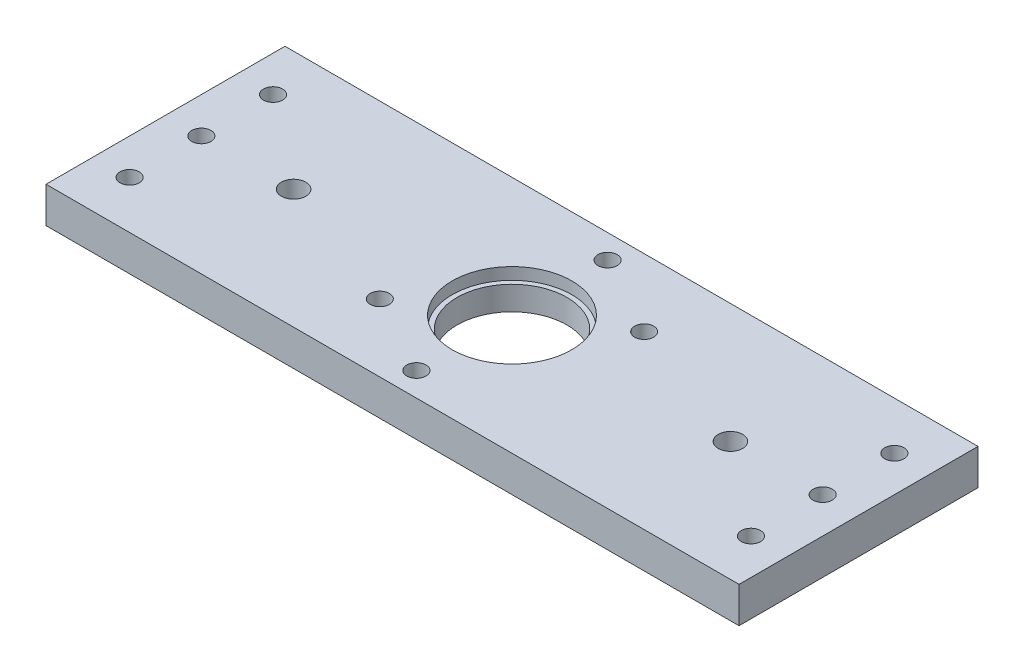
ISO-10303-21;
HEADER;
FILE_DESCRIPTION(('STEP AP214'),'2;1');
FILE_NAME('part.step','',(''),(''),'','','');
FILE_SCHEMA(('AUTOMOTIVE_DESIGN { 1 0 10303 214 1 1 1 1 }'));
ENDSEC;
DATA;
#1=APPLICATION_CONTEXT('core data for automotive mechanical design processes');
#2=APPLICATION_PROTOCOL_DEFINITION('international standard','automotive_design',2000,#1);
#3=PRODUCT_CONTEXT('',#1,'mechanical');
#4=PRODUCT('Part','Part','',(#3));
#5=PRODUCT_RELATED_PRODUCT_CATEGORY('part','',(#4));
#6=PRODUCT_DEFINITION_FORMATION('','',#4);
#7=PRODUCT_DEFINITION_CONTEXT('part definition',#1,'design');
#8=PRODUCT_DEFINITION('design','',#6,#7);
#9=PRODUCT_DEFINITION_SHAPE('','',#8);
#10=(LENGTH_UNIT() NAMED_UNIT(*) SI_UNIT(.MILLI.,.METRE.));
#11=(NAMED_UNIT(*) PLANE_ANGLE_UNIT() SI_UNIT($,.RADIAN.));
#12=(NAMED_UNIT(*) SI_UNIT($,.STERADIAN.) SOLID_ANGLE_UNIT());
#13=UNCERTAINTY_MEASURE_WITH_UNIT(LENGTH_MEASURE(1.E-05),#10,'distance_accuracy_value','');
#14=(GEOMETRIC_REPRESENTATION_CONTEXT(3) GLOBAL_UNCERTAINTY_ASSIGNED_CONTEXT((#13)) GLOBAL_UNIT_ASSIGNED_CONTEXT((#10,
#11,#12)) REPRESENTATION_CONTEXT('',''));
#15=CARTESIAN_POINT('',(0.,0.,0.));
#16=DIRECTION('',(0.,0.,1.));
#17=DIRECTION('',(1.,0.,0.));
#18=AXIS2_PLACEMENT_3D('',#15,#16,#17);
#19=CARTESIAN_POINT('',(0.,0.,0.));
#20=DIRECTION('',(0.,1.,0.));
#21=DIRECTION('',(0.,0.,1.));
#22=AXIS2_PLACEMENT_3D('',#19,#20,#21);
#23=CYLINDRICAL_SURFACE('',#22,14.605);
#24=CARTESIAN_POINT('',(0.,0.,0.));
#25=DIRECTION('',(0.,1.,0.));
#26=DIRECTION('',(0.,0.,1.));
#27=AXIS2_PLACEMENT_3D('',#24,#25,#26);
#28=CIRCLE('',#27,14.605);
#29=CARTESIAN_POINT('',(0.,0.,14.605));
#30=VERTEX_POINT('',#29);
#31=EDGE_CURVE('E103',#30,#30,#28,.T.);
#32=CARTESIAN_POINT('',(0.,6.35,0.));
#33=DIRECTION('',(0.,1.,0.));
#34=DIRECTION('',(0.,0.,1.));
#35=AXIS2_PLACEMENT_3D('',#32,#33,#34);
#36=CIRCLE('',#35,14.605);
#37=CARTESIAN_POINT('',(0.,6.35,14.605));
#38=VERTEX_POINT('',#37);
#39=EDGE_CURVE('E38',#38,#38,#36,.F.);
#40=CARTESIAN_POINT('',(0.,0.,14.605));
#41=CARTESIAN_POINT('',(0.,0.0661458333333333,14.605));
#42=CARTESIAN_POINT('',(0.,0.132291666666667,14.605));
#43=CARTESIAN_POINT('',(0.,0.264583333333333,14.605));
#44=CARTESIAN_POINT('',(0.,0.330729166666667,14.605));
#45=CARTESIAN_POINT('',(0.,0.463020833333333,14.605));
#46=CARTESIAN_POINT('',(0.,0.529166666666667,14.605));
#47=CARTESIAN_POINT('',(0.,0.661458333333333,14.605));
#48=CARTESIAN_POINT('',(0.,0.727604166666667,14.605));
#49=CARTESIAN_POINT('',(0.,0.859895833333333,14.605));
#50=CARTESIAN_POINT('',(0.,0.926041666666667,14.605));
#51=CARTESIAN_POINT('',(0.,1.05833333333333,14.605));
#52=CARTESIAN_POINT('',(0.,1.12447916666667,14.605));
#53=CARTESIAN_POINT('',(0.,1.25677083333333,14.605));
#54=CARTESIAN_POINT('',(0.,1.32291666666667,14.605));
#55=CARTESIAN_POINT('',(0.,1.45520833333333,14.605));
#56=CARTESIAN_POINT('',(0.,1.52135416666667,14.605));
#57=CARTESIAN_POINT('',(0.,1.65364583333333,14.605));
#58=CARTESIAN_POINT('',(0.,1.71979166666667,14.605));
#59=CARTESIAN_POINT('',(0.,1.85208333333333,14.605));
#60=CARTESIAN_POINT('',(0.,1.91822916666667,14.605));
#61=CARTESIAN_POINT('',(0.,2.05052083333333,14.605));
#62=CARTESIAN_POINT('',(0.,2.11666666666667,14.605));
#63=CARTESIAN_POINT('',(0.,2.24895833333333,14.605));
#64=CARTESIAN_POINT('',(0.,2.31510416666667,14.605));
#65=CARTESIAN_POINT('',(0.,2.44739583333333,14.605));
#66=CARTESIAN_POINT('',(0.,2.51354166666667,14.605));
#67=CARTESIAN_POINT('',(0.,2.64583333333333,14.605));
#68=CARTESIAN_POINT('',(0.,2.71197916666667,14.605));
#69=CARTESIAN_POINT('',(0.,2.84427083333333,14.605));
#70=CARTESIAN_POINT('',(0.,2.91041666666667,14.605));
#71=CARTESIAN_POINT('',(0.,3.04270833333333,14.605));
#72=CARTESIAN_POINT('',(0.,3.10885416666667,14.605));
#73=CARTESIAN_POINT('',(0.,3.24114583333333,14.605));
#74=CARTESIAN_POINT('',(0.,3.30729166666667,14.605));
#75=CARTESIAN_POINT('',(0.,3.43958333333333,14.605));
#76=CARTESIAN_POINT('',(0.,3.50572916666667,14.605));
#77=CARTESIAN_POINT('',(0.,3.63802083333333,14.605));
#78=CARTESIAN_POINT('',(0.,3.70416666666667,14.605));
#79=CARTESIAN_POINT('',(0.,3.83645833333333,14.605));
#80=CARTESIAN_POINT('',(0.,3.90260416666667,14.605));
#81=CARTESIAN_POINT('',(0.,4.03489583333333,14.605));
#82=CARTESIAN_POINT('',(0.,4.10104166666667,14.605));
#83=CARTESIAN_POINT('',(0.,4.23333333333333,14.605));
#84=CARTESIAN_POINT('',(0.,4.29947916666667,14.605));
#85=CARTESIAN_POINT('',(0.,4.43177083333333,14.605));
#86=CARTESIAN_POINT('',(0.,4.49791666666667,14.605));
#87=CARTESIAN_POINT('',(0.,4.63020833333333,14.605));
#88=CARTESIAN_POINT('',(0.,4.69635416666667,14.605));
#89=CARTESIAN_POINT('',(0.,4.82864583333333,14.605));
#90=CARTESIAN_POINT('',(0.,4.89479166666667,14.605));
#91=CARTESIAN_POINT('',(0.,5.02708333333333,14.605));
#92=CARTESIAN_POINT('',(0.,5.09322916666667,14.605));
#93=CARTESIAN_POINT('',(0.,5.22552083333333,14.605));
#94=CARTESIAN_POINT('',(0.,5.29166666666667,14.605));
#95=CARTESIAN_POINT('',(0.,5.42395833333333,14.605));
#96=CARTESIAN_POINT('',(0.,5.49010416666667,14.605));
#97=CARTESIAN_POINT('',(0.,5.62239583333333,14.605));
#98=CARTESIAN_POINT('',(0.,5.68854166666667,14.605));
#99=CARTESIAN_POINT('',(0.,5.82083333333333,14.605));
#100=CARTESIAN_POINT('',(0.,5.88697916666667,14.605));
#101=CARTESIAN_POINT('',(0.,6.01927083333333,14.605));
#102=CARTESIAN_POINT('',(0.,6.08541666666667,14.605));
#103=CARTESIAN_POINT('',(0.,6.21770833333333,14.605));
#104=CARTESIAN_POINT('',(0.,6.28385416666667,14.605));
#105=CARTESIAN_POINT('',(0.,6.35,14.605));
#106=B_SPLINE_CURVE_WITH_KNOTS('',3,(#40,#41,#42,#43,#44,#45,#46,#47,#48,#49,#50,#51,#52,#53,
#54,#55,#56,#57,#58,#59,#60,#61,#62,#63,#64,#65,#66,#67,#68,#69,#70,#71,#72,#73,#74,#75,#76,#77,
#78,#79,#80,#81,#82,#83,#84,#85,#86,#87,#88,#89,#90,#91,#92,#93,#94,#95,#96,#97,#98,#99,#100,
#101,#102,#103,#104,#105),.UNSPECIFIED.,.F.,.F.,(4,2,2,2,2,2,2,2,2,2,2,2,2,2,2,2,2,2,2,2,2,2,2,
2,2,2,2,2,2,2,2,2,4),(0.,0.1984375,0.396875,0.5953125,0.79375,0.9921875,1.190625,1.3890625,
1.5875,1.7859375,1.984375,2.1828125,2.38125,2.5796875,2.778125,2.9765625,3.175,3.3734375,
3.571875,3.7703125,3.96875,4.1671875,4.365625,4.5640625,4.7625,4.9609375,5.159375,5.3578125,
5.55625,5.7546875,5.953125,6.1515625,6.35),.UNSPECIFIED.);
#107=EDGE_CURVE('BSEAM34',#30,#38,#106,.T.);
#108=ORIENTED_EDGE('',*,*,#31,.F.);
#109=ORIENTED_EDGE('',*,*,#39,.F.);
#110=ORIENTED_EDGE('',*,*,#107,.T.);
#111=ORIENTED_EDGE('',*,*,#107,.F.);
#112=EDGE_LOOP('',(#108,#110,#109,#111));
#113=FACE_BOUND('',#112,.T.);
#114=ADVANCED_FACE('F34',(#113),#23,.F.);
#115=CARTESIAN_POINT('',(92.075,9.525,31.75));
#116=DIRECTION('',(-1.,0.,0.));
#117=DIRECTION('',(0.,0.,1.));
#118=AXIS2_PLACEMENT_3D('',#115,#116,#117);
#119=PLANE('',#118);
#120=DIRECTION('',(0.,0.,-1.));
#121=VECTOR('',#120,1.);
#122=CARTESIAN_POINT('',(92.075,0.,31.75));
#123=LINE('',#122,#121);
#124=CARTESIAN_POINT('',(92.075,0.,31.75));
#125=VERTEX_POINT('',#124);
#126=CARTESIAN_POINT('',(92.075,0.,-31.75));
#127=VERTEX_POINT('',#126);
#128=EDGE_CURVE('E100',#125,#127,#123,.T.);
#129=ORIENTED_EDGE('',*,*,#128,.T.);
#130=DIRECTION('',(0.,-1.,0.));
#131=VECTOR('',#130,1.);
#132=CARTESIAN_POINT('',(92.075,9.525,-31.75));
#133=LINE('',#132,#131);
#134=CARTESIAN_POINT('',(92.075,9.525,-31.75));
#135=VERTEX_POINT('',#134);
#136=EDGE_CURVE('E11',#135,#127,#133,.T.);
#137=ORIENTED_EDGE('',*,*,#136,.F.);
#138=DIRECTION('',(0.,0.,-1.));
#139=VECTOR('',#138,1.);
#140=CARTESIAN_POINT('',(92.075,9.525,31.75));
#141=LINE('',#140,#139);
#142=CARTESIAN_POINT('',(92.075,9.525,31.75));
#143=VERTEX_POINT('',#142);
#144=EDGE_CURVE('E87',#143,#135,#141,.T.);
#145=ORIENTED_EDGE('',*,*,#144,.F.);
#146=DIRECTION('',(0.,-1.,0.));
#147=VECTOR('',#146,1.);
#148=CARTESIAN_POINT('',(92.075,9.525,31.75));
#149=LINE('',#148,#147);
#150=EDGE_CURVE('E96',#143,#125,#149,.T.);
#151=ORIENTED_EDGE('',*,*,#150,.T.);
#152=EDGE_LOOP('',(#129,#137,#145,#151));
#153=FACE_BOUND('',#152,.T.);
#154=ADVANCED_FACE('F36',(#153),#119,.F.);
#155=CARTESIAN_POINT('',(-92.075,9.525,-31.75));
#156=DIRECTION('',(0.,0.,1.));
#157=DIRECTION('',(1.,0.,0.));
#158=AXIS2_PLACEMENT_3D('',#155,#156,#157);
#159=PLANE('',#158);
#160=DIRECTION('',(-1.,0.,0.));
#161=VECTOR('',#160,1.);
#162=CARTESIAN_POINT('',(-92.075,0.,-31.75));
#163=LINE('',#162,#161);
#164=CARTESIAN_POINT('',(-92.075,0.,-31.75));
#165=VERTEX_POINT('',#164);
#166=EDGE_CURVE('E91',#127,#165,#163,.T.);
#167=ORIENTED_EDGE('',*,*,#166,.T.);
#168=DIRECTION('',(0.,-1.,0.));
#169=VECTOR('',#168,1.);
#170=CARTESIAN_POINT('',(-92.075,9.525,-31.75));
#171=LINE('',#170,#169);
#172=CARTESIAN_POINT('',(-92.075,9.525,-31.75));
#173=VERTEX_POINT('',#172);
#174=EDGE_CURVE('E44',#173,#165,#171,.T.);
#175=ORIENTED_EDGE('',*,*,#174,.F.);
#176=DIRECTION('',(-1.,0.,0.));
#177=VECTOR('',#176,1.);
#178=CARTESIAN_POINT('',(-92.075,9.525,-31.75));
#179=LINE('',#178,#177);
#180=EDGE_CURVE('E82',#135,#173,#179,.T.);
#181=ORIENTED_EDGE('',*,*,#180,.F.);
#182=ORIENTED_EDGE('',*,*,#136,.T.);
#183=EDGE_LOOP('',(#167,#175,#181,#182));
#184=FACE_BOUND('',#183,.T.);
#185=ADVANCED_FACE('F90',(#184),#159,.F.);
#186=CARTESIAN_POINT('',(-92.075,9.525,31.75));
#187=DIRECTION('',(1.,0.,0.));
#188=DIRECTION('',(0.,0.,-1.));
#189=AXIS2_PLACEMENT_3D('',#186,#187,#188);
#190=PLANE('',#189);
#191=DIRECTION('',(0.,0.,1.));
#192=VECTOR('',#191,1.);
#193=CARTESIAN_POINT('',(-92.075,0.,31.75));
#194=LINE('',#193,#192);
#195=CARTESIAN_POINT('',(-92.075,0.,31.75));
#196=VERTEX_POINT('',#195);
#197=EDGE_CURVE('E69',#165,#196,#194,.T.);
#198=ORIENTED_EDGE('',*,*,#197,.T.);
#199=DIRECTION('',(0.,-1.,0.));
#200=VECTOR('',#199,1.);
#201=CARTESIAN_POINT('',(-92.075,9.525,31.75));
#202=LINE('',#201,#200);
#203=CARTESIAN_POINT('',(-92.075,9.525,31.75));
#204=VERTEX_POINT('',#203);
#205=EDGE_CURVE('E92',#204,#196,#202,.T.);
#206=ORIENTED_EDGE('',*,*,#205,.F.);
#207=DIRECTION('',(0.,0.,1.));
#208=VECTOR('',#207,1.);
#209=CARTESIAN_POINT('',(-92.075,9.525,31.75));
#210=LINE('',#209,#208);
#211=EDGE_CURVE('E85',#173,#204,#210,.T.);
#212=ORIENTED_EDGE('',*,*,#211,.F.);
#213=ORIENTED_EDGE('',*,*,#174,.T.);
#214=EDGE_LOOP('',(#198,#206,#212,#213));
#215=FACE_BOUND('',#214,.T.);
#216=ADVANCED_FACE('F94',(#215),#190,.F.);
#217=CARTESIAN_POINT('',(-92.075,9.525,31.75));
#218=DIRECTION('',(0.,0.,-1.));
#219=DIRECTION('',(-1.,0.,0.));
#220=AXIS2_PLACEMENT_3D('',#217,#218,#219);
#221=PLANE('',#220);
#222=DIRECTION('',(1.,0.,0.));
#223=VECTOR('',#222,1.);
#224=CARTESIAN_POINT('',(-92.075,0.,31.75));
#225=LINE('',#224,#223);
#226=EDGE_CURVE('E75',#196,#125,#225,.T.);
#227=ORIENTED_EDGE('',*,*,#226,.T.);
#228=ORIENTED_EDGE('',*,*,#150,.F.);
#229=DIRECTION('',(1.,0.,0.));
#230=VECTOR('',#229,1.);
#231=CARTESIAN_POINT('',(-92.075,9.525,31.75));
#232=LINE('',#231,#230);
#233=EDGE_CURVE('E52',#204,#143,#232,.T.);
#234=ORIENTED_EDGE('',*,*,#233,.F.);
#235=ORIENTED_EDGE('',*,*,#205,.T.);
#236=EDGE_LOOP('',(#227,#228,#234,#235));
#237=FACE_BOUND('',#236,.T.);
#238=ADVANCED_FACE('F108',(#237),#221,.F.);
#239=CARTESIAN_POINT('',(0.,9.525,0.));
#240=DIRECTION('',(0.,-1.,0.));
#241=DIRECTION('',(0.,0.,-1.));
#242=AXIS2_PLACEMENT_3D('',#239,#240,#241);
#243=PLANE('',#242);
#244=CARTESIAN_POINT('',(-21.329210467338,9.525,13.7922));
#245=DIRECTION('',(0.,-1.,0.));
#246=DIRECTION('',(0.,0.,-1.));
#247=AXIS2_PLACEMENT_3D('',#244,#245,#246);
#248=CIRCLE('',#247,2.54);
#249=CARTESIAN_POINT('',(-21.329210467338,9.525,11.2522));
#250=VERTEX_POINT('',#249);
#251=EDGE_CURVE('E182',#250,#250,#248,.T.);
#252=ORIENTED_EDGE('',*,*,#251,.T.);
#253=EDGE_LOOP('',(#252));
#254=FACE_BOUND('',#253,.T.);
#255=CARTESIAN_POINT('',(21.329210467338,9.525,-13.7922));
#256=DIRECTION('',(0.,-1.,0.));
#257=DIRECTION('',(0.,0.,-1.));
#258=AXIS2_PLACEMENT_3D('',#255,#256,#257);
#259=CIRCLE('',#258,2.54);
#260=CARTESIAN_POINT('',(21.329210467338,9.525,-16.3322));
#261=VERTEX_POINT('',#260);
#262=EDGE_CURVE('E186',#261,#261,#259,.T.);
#263=ORIENTED_EDGE('',*,*,#262,.T.);
#264=EDGE_LOOP('',(#263));
#265=FACE_BOUND('',#264,.T.);
#266=CARTESIAN_POINT('',(-82.55,9.525,-19.05));
#267=DIRECTION('',(0.,1.,0.));
#268=DIRECTION('',(0.,0.,1.));
#269=AXIS2_PLACEMENT_3D('',#266,#267,#268);
#270=CIRCLE('',#269,2.55270000000001);
#271=CARTESIAN_POINT('',(-82.55,9.525,-16.4973));
#272=VERTEX_POINT('',#271);
#273=EDGE_CURVE('E179',#272,#272,#270,.T.);
#274=ORIENTED_EDGE('',*,*,#273,.F.);
#275=EDGE_LOOP('',(#274));
#276=FACE_BOUND('',#275,.T.);
#277=CARTESIAN_POINT('',(-82.55,9.525,19.05));
#278=DIRECTION('',(0.,1.,0.));
#279=DIRECTION('',(0.,0.,1.));
#280=AXIS2_PLACEMENT_3D('',#277,#278,#279);
#281=CIRCLE('',#280,2.55270000000001);
#282=CARTESIAN_POINT('',(-82.55,9.525,21.6027));
#283=VERTEX_POINT('',#282);
#284=EDGE_CURVE('E173',#283,#283,#281,.T.);
#285=ORIENTED_EDGE('',*,*,#284,.F.);
#286=EDGE_LOOP('',(#285));
#287=FACE_BOUND('',#286,.T.);
#288=CARTESIAN_POINT('',(82.55,9.525,19.05));
#289=DIRECTION('',(0.,1.,0.));
#290=DIRECTION('',(0.,0.,1.));
#291=AXIS2_PLACEMENT_3D('',#288,#289,#290);
#292=CIRCLE('',#291,2.55270000000001);
#293=CARTESIAN_POINT('',(82.55,9.525,21.6027));
#294=VERTEX_POINT('',#293);
#295=EDGE_CURVE('E167',#294,#294,#292,.T.);
#296=ORIENTED_EDGE('',*,*,#295,.F.);
#297=EDGE_LOOP('',(#296));
#298=FACE_BOUND('',#297,.T.);
#299=CARTESIAN_POINT('',(82.55,9.525,-19.05));
#300=DIRECTION('',(0.,1.,0.));
#301=DIRECTION('',(0.,0.,1.));
#302=AXIS2_PLACEMENT_3D('',#299,#300,#301);
#303=CIRCLE('',#302,2.55270000000001);
#304=CARTESIAN_POINT('',(82.55,9.525,-16.4973));
#305=VERTEX_POINT('',#304);
#306=EDGE_CURVE('E161',#305,#305,#303,.T.);
#307=ORIENTED_EDGE('',*,*,#306,.F.);
#308=EDGE_LOOP('',(#307));
#309=FACE_BOUND('',#308,.T.);
#310=CARTESIAN_POINT('',(-82.55,9.525,0.));
#311=DIRECTION('',(0.,1.,0.));
#312=DIRECTION('',(0.,0.,1.));
#313=AXIS2_PLACEMENT_3D('',#310,#311,#312);
#314=CIRCLE('',#313,2.55270000000001);
#315=CARTESIAN_POINT('',(-82.55,9.525,2.55270000000001));
#316=VERTEX_POINT('',#315);
#317=EDGE_CURVE('E155',#316,#316,#314,.T.);
#318=ORIENTED_EDGE('',*,*,#317,.F.);
#319=EDGE_LOOP('',(#318));
#320=FACE_BOUND('',#319,.T.);
#321=CARTESIAN_POINT('',(82.55,9.525,0.));
#322=DIRECTION('',(0.,1.,0.));
#323=DIRECTION('',(0.,0.,1.));
#324=AXIS2_PLACEMENT_3D('',#321,#322,#323);
#325=CIRCLE('',#324,2.55270000000001);
#326=CARTESIAN_POINT('',(82.55,9.525,2.55270000000001));
#327=VERTEX_POINT('',#326);
#328=EDGE_CURVE('E149',#327,#327,#325,.T.);
#329=ORIENTED_EDGE('',*,*,#328,.F.);
#330=EDGE_LOOP('',(#329));
#331=FACE_BOUND('',#330,.T.);
#332=CARTESIAN_POINT('',(0.,9.525,0.));
#333=DIRECTION('',(0.,1.,0.));
#334=DIRECTION('',(0.,0.,1.));
#335=AXIS2_PLACEMENT_3D('',#332,#333,#334);
#336=CIRCLE('',#335,15.875);
#337=CARTESIAN_POINT('',(0.,9.525,15.875));
#338=VERTEX_POINT('',#337);
#339=EDGE_CURVE('E140',#338,#338,#336,.T.);
#340=ORIENTED_EDGE('',*,*,#339,.F.);
#341=EDGE_LOOP('',(#340));
#342=FACE_BOUND('',#341,.T.);
#343=CARTESIAN_POINT('',(-58.0390000000001,9.525,0.));
#344=DIRECTION('',(0.,-1.,0.));
#345=DIRECTION('',(0.,0.,-1.));
#346=AXIS2_PLACEMENT_3D('',#343,#344,#345);
#347=CIRCLE('',#346,3.25);
#348=CARTESIAN_POINT('',(-58.0390000000001,9.525,-3.25));
#349=VERTEX_POINT('',#348);
#350=EDGE_CURVE('E134',#349,#349,#347,.T.);
#351=ORIENTED_EDGE('',*,*,#350,.T.);
#352=EDGE_LOOP('',(#351));
#353=FACE_BOUND('',#352,.T.);
#354=CARTESIAN_POINT('',(58.039,9.525,0.));
#355=DIRECTION('',(0.,-1.,0.));
#356=DIRECTION('',(0.,0.,-1.));
#357=AXIS2_PLACEMENT_3D('',#354,#355,#356);
#358=CIRCLE('',#357,3.25);
#359=CARTESIAN_POINT('',(58.039,9.525,-3.25));
#360=VERTEX_POINT('',#359);
#361=EDGE_CURVE('E128',#360,#360,#358,.T.);
#362=ORIENTED_EDGE('',*,*,#361,.T.);
#363=EDGE_LOOP('',(#362));
#364=FACE_BOUND('',#363,.T.);
#365=CARTESIAN_POINT('',(0.,9.525,25.4));
#366=DIRECTION('',(0.,-1.,0.));
#367=DIRECTION('',(0.,0.,-1.));
#368=AXIS2_PLACEMENT_3D('',#365,#366,#367);
#369=CIRCLE('',#368,2.5527);
#370=CARTESIAN_POINT('',(0.,9.525,22.8473));
#371=VERTEX_POINT('',#370);
#372=EDGE_CURVE('E122',#371,#371,#369,.T.);
#373=ORIENTED_EDGE('',*,*,#372,.T.);
#374=EDGE_LOOP('',(#373));
#375=FACE_BOUND('',#374,.T.);
#376=CARTESIAN_POINT('',(0.,9.525,-25.4));
#377=DIRECTION('',(0.,-1.,0.));
#378=DIRECTION('',(0.,0.,-1.));
#379=AXIS2_PLACEMENT_3D('',#376,#377,#378);
#380=CIRCLE('',#379,2.5527);
#381=CARTESIAN_POINT('',(0.,9.525,-27.9527));
#382=VERTEX_POINT('',#381);
#383=EDGE_CURVE('E116',#382,#382,#380,.T.);
#384=ORIENTED_EDGE('',*,*,#383,.T.);
#385=EDGE_LOOP('',(#384));
#386=FACE_BOUND('',#385,.T.);
#387=ORIENTED_EDGE('',*,*,#144,.T.);
#388=ORIENTED_EDGE('',*,*,#180,.T.);
#389=ORIENTED_EDGE('',*,*,#211,.T.);
#390=ORIENTED_EDGE('',*,*,#233,.T.);
#391=EDGE_LOOP('',(#387,#388,#389,#390));
#392=FACE_BOUND('',#391,.T.);
#393=ADVANCED_FACE('F83',(#254,#265,#276,#287,#298,#309,#320,#331,#342,#353,#364,#375,#386,
#392),#243,.F.);
#394=CARTESIAN_POINT('',(0.,0.,0.));
#395=DIRECTION('',(0.,-1.,0.));
#396=DIRECTION('',(0.,0.,-1.));
#397=AXIS2_PLACEMENT_3D('',#394,#395,#396);
#398=PLANE('',#397);
#399=CARTESIAN_POINT('',(-21.329210467338,0.,13.7922));
#400=DIRECTION('',(0.,-1.,0.));
#401=DIRECTION('',(0.,0.,-1.));
#402=AXIS2_PLACEMENT_3D('',#399,#400,#401);
#403=CIRCLE('',#402,2.54);
#404=CARTESIAN_POINT('',(-21.329210467338,0.,11.2522));
#405=VERTEX_POINT('',#404);
#406=EDGE_CURVE('E189',#405,#405,#403,.T.);
#407=ORIENTED_EDGE('',*,*,#406,.F.);
#408=EDGE_LOOP('',(#407));
#409=FACE_BOUND('',#408,.T.);
#410=CARTESIAN_POINT('',(21.329210467338,0.,-13.7922));
#411=DIRECTION('',(0.,-1.,0.));
#412=DIRECTION('',(0.,0.,-1.));
#413=AXIS2_PLACEMENT_3D('',#410,#411,#412);
#414=CIRCLE('',#413,2.54);
#415=CARTESIAN_POINT('',(21.329210467338,0.,-16.3322));
#416=VERTEX_POINT('',#415);
#417=EDGE_CURVE('E183',#416,#416,#414,.T.);
#418=ORIENTED_EDGE('',*,*,#417,.F.);
#419=EDGE_LOOP('',(#418));
#420=FACE_BOUND('',#419,.T.);
#421=CARTESIAN_POINT('',(-82.55,0.,-19.05));
#422=DIRECTION('',(0.,1.,0.));
#423=DIRECTION('',(0.,0.,1.));
#424=AXIS2_PLACEMENT_3D('',#421,#422,#423);
#425=CIRCLE('',#424,2.55269999999999);
#426=CARTESIAN_POINT('',(-82.55,0.,-16.4973));
#427=VERTEX_POINT('',#426);
#428=EDGE_CURVE('E176',#427,#427,#425,.T.);
#429=ORIENTED_EDGE('',*,*,#428,.T.);
#430=EDGE_LOOP('',(#429));
#431=FACE_BOUND('',#430,.T.);
#432=CARTESIAN_POINT('',(-82.55,0.,19.05));
#433=DIRECTION('',(0.,1.,0.));
#434=DIRECTION('',(0.,0.,1.));
#435=AXIS2_PLACEMENT_3D('',#432,#433,#434);
#436=CIRCLE('',#435,2.55269999999999);
#437=CARTESIAN_POINT('',(-82.55,0.,21.6027));
#438=VERTEX_POINT('',#437);
#439=EDGE_CURVE('E170',#438,#438,#436,.T.);
#440=ORIENTED_EDGE('',*,*,#439,.T.);
#441=EDGE_LOOP('',(#440));
#442=FACE_BOUND('',#441,.T.);
#443=CARTESIAN_POINT('',(82.55,0.,19.05));
#444=DIRECTION('',(0.,1.,0.));
#445=DIRECTION('',(0.,0.,1.));
#446=AXIS2_PLACEMENT_3D('',#443,#444,#445);
#447=CIRCLE('',#446,2.55269999999999);
#448=CARTESIAN_POINT('',(82.55,0.,21.6027));
#449=VERTEX_POINT('',#448);
#450=EDGE_CURVE('E164',#449,#449,#447,.T.);
#451=ORIENTED_EDGE('',*,*,#450,.T.);
#452=EDGE_LOOP('',(#451));
#453=FACE_BOUND('',#452,.T.);
#454=CARTESIAN_POINT('',(82.55,0.,-19.05));
#455=DIRECTION('',(0.,1.,0.));
#456=DIRECTION('',(0.,0.,1.));
#457=AXIS2_PLACEMENT_3D('',#454,#455,#456);
#458=CIRCLE('',#457,2.55269999999999);
#459=CARTESIAN_POINT('',(82.55,0.,-16.4973));
#460=VERTEX_POINT('',#459);
#461=EDGE_CURVE('E158',#460,#460,#458,.T.);
#462=ORIENTED_EDGE('',*,*,#461,.T.);
#463=EDGE_LOOP('',(#462));
#464=FACE_BOUND('',#463,.T.);
#465=CARTESIAN_POINT('',(-82.55,0.,0.));
#466=DIRECTION('',(0.,1.,0.));
#467=DIRECTION('',(0.,0.,1.));
#468=AXIS2_PLACEMENT_3D('',#465,#466,#467);
#469=CIRCLE('',#468,2.55269999999999);
#470=CARTESIAN_POINT('',(-82.55,0.,2.55269999999999));
#471=VERTEX_POINT('',#470);
#472=EDGE_CURVE('E152',#471,#471,#469,.T.);
#473=ORIENTED_EDGE('',*,*,#472,.T.);
#474=EDGE_LOOP('',(#473));
#475=FACE_BOUND('',#474,.T.);
#476=CARTESIAN_POINT('',(82.55,0.,0.));
#477=DIRECTION('',(0.,1.,0.));
#478=DIRECTION('',(0.,0.,1.));
#479=AXIS2_PLACEMENT_3D('',#476,#477,#478);
#480=CIRCLE('',#479,2.55269999999999);
#481=CARTESIAN_POINT('',(82.55,0.,2.55269999999999));
#482=VERTEX_POINT('',#481);
#483=EDGE_CURVE('E144',#482,#482,#480,.T.);
#484=ORIENTED_EDGE('',*,*,#483,.T.);
#485=EDGE_LOOP('',(#484));
#486=FACE_BOUND('',#485,.T.);
#487=CARTESIAN_POINT('',(-58.0390000000001,0.,0.));
#488=DIRECTION('',(0.,-1.,0.));
#489=DIRECTION('',(0.,0.,-1.));
#490=AXIS2_PLACEMENT_3D('',#487,#488,#489);
#491=CIRCLE('',#490,3.25);
#492=CARTESIAN_POINT('',(-58.0390000000001,0.,-3.25));
#493=VERTEX_POINT('',#492);
#494=EDGE_CURVE('E137',#493,#493,#491,.T.);
#495=ORIENTED_EDGE('',*,*,#494,.F.);
#496=EDGE_LOOP('',(#495));
#497=FACE_BOUND('',#496,.T.);
#498=CARTESIAN_POINT('',(58.039,0.,0.));
#499=DIRECTION('',(0.,-1.,0.));
#500=DIRECTION('',(0.,0.,-1.));
#501=AXIS2_PLACEMENT_3D('',#498,#499,#500);
#502=CIRCLE('',#501,3.25);
#503=CARTESIAN_POINT('',(58.039,0.,-3.25));
#504=VERTEX_POINT('',#503);
#505=EDGE_CURVE('E131',#504,#504,#502,.T.);
#506=ORIENTED_EDGE('',*,*,#505,.F.);
#507=EDGE_LOOP('',(#506));
#508=FACE_BOUND('',#507,.T.);
#509=CARTESIAN_POINT('',(0.,0.,25.4));
#510=DIRECTION('',(0.,-1.,0.));
#511=DIRECTION('',(0.,0.,-1.));
#512=AXIS2_PLACEMENT_3D('',#509,#510,#511);
#513=CIRCLE('',#512,2.5527);
#514=CARTESIAN_POINT('',(0.,0.,22.8473));
#515=VERTEX_POINT('',#514);
#516=EDGE_CURVE('E125',#515,#515,#513,.T.);
#517=ORIENTED_EDGE('',*,*,#516,.F.);
#518=EDGE_LOOP('',(#517));
#519=FACE_BOUND('',#518,.T.);
#520=CARTESIAN_POINT('',(0.,0.,-25.4));
#521=DIRECTION('',(0.,-1.,0.));
#522=DIRECTION('',(0.,0.,-1.));
#523=AXIS2_PLACEMENT_3D('',#520,#521,#522);
#524=CIRCLE('',#523,2.5527);
#525=CARTESIAN_POINT('',(0.,0.,-27.9527));
#526=VERTEX_POINT('',#525);
#527=EDGE_CURVE('E119',#526,#526,#524,.T.);
#528=ORIENTED_EDGE('',*,*,#527,.F.);
#529=EDGE_LOOP('',(#528));
#530=FACE_BOUND('',#529,.T.);
#531=ORIENTED_EDGE('',*,*,#31,.T.);
#532=EDGE_LOOP('',(#531));
#533=FACE_BOUND('',#532,.T.);
#534=ORIENTED_EDGE('',*,*,#128,.F.);
#535=ORIENTED_EDGE('',*,*,#226,.F.);
#536=ORIENTED_EDGE('',*,*,#197,.F.);
#537=ORIENTED_EDGE('',*,*,#166,.F.);
#538=EDGE_LOOP('',(#534,#535,#536,#537));
#539=FACE_BOUND('',#538,.T.);
#540=ADVANCED_FACE('F111',(#409,#420,#431,#442,#453,#464,#475,#486,#497,#508,#519,#530,#533,
#539),#398,.T.);
#541=CARTESIAN_POINT('',(0.,0.,-25.4));
#542=DIRECTION('',(0.,-1.,0.));
#543=DIRECTION('',(0.,0.,-1.));
#544=AXIS2_PLACEMENT_3D('',#541,#542,#543);
#545=CYLINDRICAL_SURFACE('',#544,2.5527);
#546=ORIENTED_EDGE('',*,*,#383,.F.);
#547=EDGE_LOOP('',(#546));
#548=FACE_BOUND('',#547,.T.);
#549=ORIENTED_EDGE('',*,*,#527,.T.);
#550=EDGE_LOOP('',(#549));
#551=FACE_BOUND('',#550,.T.);
#552=ADVANCED_FACE('F206',(#548,#551),#545,.F.);
#553=CARTESIAN_POINT('',(0.,0.,25.4));
#554=DIRECTION('',(0.,-1.,0.));
#555=DIRECTION('',(0.,0.,-1.));
#556=AXIS2_PLACEMENT_3D('',#553,#554,#555);
#557=CYLINDRICAL_SURFACE('',#556,2.5527);
#558=ORIENTED_EDGE('',*,*,#372,.F.);
#559=EDGE_LOOP('',(#558));
#560=FACE_BOUND('',#559,.T.);
#561=ORIENTED_EDGE('',*,*,#516,.T.);
#562=EDGE_LOOP('',(#561));
#563=FACE_BOUND('',#562,.T.);
#564=ADVANCED_FACE('F259',(#560,#563),#557,.F.);
#565=CARTESIAN_POINT('',(58.039,0.,0.));
#566=DIRECTION('',(0.,-1.,0.));
#567=DIRECTION('',(0.,0.,-1.));
#568=AXIS2_PLACEMENT_3D('',#565,#566,#567);
#569=CYLINDRICAL_SURFACE('',#568,3.25);
#570=ORIENTED_EDGE('',*,*,#361,.F.);
#571=EDGE_LOOP('',(#570));
#572=FACE_BOUND('',#571,.T.);
#573=ORIENTED_EDGE('',*,*,#505,.T.);
#574=EDGE_LOOP('',(#573));
#575=FACE_BOUND('',#574,.T.);
#576=ADVANCED_FACE('F251',(#572,#575),#569,.F.);
#577=CARTESIAN_POINT('',(-58.0390000000001,0.,0.));
#578=DIRECTION('',(0.,-1.,0.));
#579=DIRECTION('',(0.,0.,-1.));
#580=AXIS2_PLACEMENT_3D('',#577,#578,#579);
#581=CYLINDRICAL_SURFACE('',#580,3.25);
#582=ORIENTED_EDGE('',*,*,#350,.F.);
#583=EDGE_LOOP('',(#582));
#584=FACE_BOUND('',#583,.T.);
#585=ORIENTED_EDGE('',*,*,#494,.T.);
#586=EDGE_LOOP('',(#585));
#587=FACE_BOUND('',#586,.T.);
#588=ADVANCED_FACE('F241',(#584,#587),#581,.F.);
#589=CARTESIAN_POINT('',(0.,6.35,0.));
#590=DIRECTION('',(0.,1.,0.));
#591=DIRECTION('',(0.,0.,1.));
#592=AXIS2_PLACEMENT_3D('',#589,#590,#591);
#593=PLANE('',#592);
#594=CARTESIAN_POINT('',(0.,6.35,0.));
#595=DIRECTION('',(0.,1.,0.));
#596=DIRECTION('',(0.,0.,1.));
#597=AXIS2_PLACEMENT_3D('',#594,#595,#596);
#598=CIRCLE('',#597,15.875);
#599=CARTESIAN_POINT('',(0.,6.35,15.875));
#600=VERTEX_POINT('',#599);
#601=EDGE_CURVE('E143',#600,#600,#598,.T.);
#602=ORIENTED_EDGE('',*,*,#601,.T.);
#603=EDGE_LOOP('',(#602));
#604=FACE_BOUND('',#603,.T.);
#605=ORIENTED_EDGE('',*,*,#39,.T.);
#606=EDGE_LOOP('',(#605));
#607=FACE_BOUND('',#606,.T.);
#608=ADVANCED_FACE('F238',(#604,#607),#593,.T.);
#609=CARTESIAN_POINT('',(0.,6.35,0.));
#610=DIRECTION('',(0.,1.,0.));
#611=DIRECTION('',(0.,0.,1.));
#612=AXIS2_PLACEMENT_3D('',#609,#610,#611);
#613=CYLINDRICAL_SURFACE('',#612,15.875);
#614=ORIENTED_EDGE('',*,*,#601,.F.);
#615=EDGE_LOOP('',(#614));
#616=FACE_BOUND('',#615,.T.);
#617=ORIENTED_EDGE('',*,*,#339,.T.);
#618=EDGE_LOOP('',(#617));
#619=FACE_BOUND('',#618,.T.);
#620=ADVANCED_FACE('F240',(#616,#619),#613,.F.);
#621=CARTESIAN_POINT('',(82.55,9.525,0.));
#622=DIRECTION('',(0.,1.,0.));
#623=DIRECTION('',(0.,0.,1.));
#624=AXIS2_PLACEMENT_3D('',#621,#622,#623);
#625=CYLINDRICAL_SURFACE('',#624,2.5527);
#626=ORIENTED_EDGE('',*,*,#483,.F.);
#627=EDGE_LOOP('',(#626));
#628=FACE_BOUND('',#627,.T.);
#629=ORIENTED_EDGE('',*,*,#328,.T.);
#630=EDGE_LOOP('',(#629));
#631=FACE_BOUND('',#630,.T.);
#632=ADVANCED_FACE('F248',(#628,#631),#625,.F.);
#633=CARTESIAN_POINT('',(-82.55,9.525,0.));
#634=DIRECTION('',(0.,1.,0.));
#635=DIRECTION('',(0.,0.,1.));
#636=AXIS2_PLACEMENT_3D('',#633,#634,#635);
#637=CYLINDRICAL_SURFACE('',#636,2.5527);
#638=ORIENTED_EDGE('',*,*,#472,.F.);
#639=EDGE_LOOP('',(#638));
#640=FACE_BOUND('',#639,.T.);
#641=ORIENTED_EDGE('',*,*,#317,.T.);
#642=EDGE_LOOP('',(#641));
#643=FACE_BOUND('',#642,.T.);
#644=ADVANCED_FACE('F305',(#640,#643),#637,.F.);
#645=CARTESIAN_POINT('',(82.55,9.525,-19.05));
#646=DIRECTION('',(0.,1.,0.));
#647=DIRECTION('',(0.,0.,1.));
#648=AXIS2_PLACEMENT_3D('',#645,#646,#647);
#649=CYLINDRICAL_SURFACE('',#648,2.5527);
#650=ORIENTED_EDGE('',*,*,#461,.F.);
#651=EDGE_LOOP('',(#650));
#652=FACE_BOUND('',#651,.T.);
#653=ORIENTED_EDGE('',*,*,#306,.T.);
#654=EDGE_LOOP('',(#653));
#655=FACE_BOUND('',#654,.T.);
#656=ADVANCED_FACE('F314',(#652,#655),#649,.F.);
#657=CARTESIAN_POINT('',(82.55,9.525,19.05));
#658=DIRECTION('',(0.,1.,0.));
#659=DIRECTION('',(0.,0.,1.));
#660=AXIS2_PLACEMENT_3D('',#657,#658,#659);
#661=CYLINDRICAL_SURFACE('',#660,2.5527);
#662=ORIENTED_EDGE('',*,*,#450,.F.);
#663=EDGE_LOOP('',(#662));
#664=FACE_BOUND('',#663,.T.);
#665=ORIENTED_EDGE('',*,*,#295,.T.);
#666=EDGE_LOOP('',(#665));
#667=FACE_BOUND('',#666,.T.);
#668=ADVANCED_FACE('F323',(#664,#667),#661,.F.);
#669=CARTESIAN_POINT('',(-82.55,9.525,19.05));
#670=DIRECTION('',(0.,1.,0.));
#671=DIRECTION('',(0.,0.,1.));
#672=AXIS2_PLACEMENT_3D('',#669,#670,#671);
#673=CYLINDRICAL_SURFACE('',#672,2.5527);
#674=ORIENTED_EDGE('',*,*,#439,.F.);
#675=EDGE_LOOP('',(#674));
#676=FACE_BOUND('',#675,.T.);
#677=ORIENTED_EDGE('',*,*,#284,.T.);
#678=EDGE_LOOP('',(#677));
#679=FACE_BOUND('',#678,.T.);
#680=ADVANCED_FACE('F333',(#676,#679),#673,.F.);
#681=CARTESIAN_POINT('',(-82.55,9.525,-19.05));
#682=DIRECTION('',(0.,1.,0.));
#683=DIRECTION('',(0.,0.,1.));
#684=AXIS2_PLACEMENT_3D('',#681,#682,#683);
#685=CYLINDRICAL_SURFACE('',#684,2.5527);
#686=ORIENTED_EDGE('',*,*,#428,.F.);
#687=EDGE_LOOP('',(#686));
#688=FACE_BOUND('',#687,.T.);
#689=ORIENTED_EDGE('',*,*,#273,.T.);
#690=EDGE_LOOP('',(#689));
#691=FACE_BOUND('',#690,.T.);
#692=ADVANCED_FACE('F343',(#688,#691),#685,.F.);
#693=CARTESIAN_POINT('',(21.329210467338,9.525,-13.7922));
#694=DIRECTION('',(0.,-1.,0.));
#695=DIRECTION('',(0.,0.,-1.));
#696=AXIS2_PLACEMENT_3D('',#693,#694,#695);
#697=CYLINDRICAL_SURFACE('',#696,2.54);
#698=CARTESIAN_POINT('',(21.329210467338,9.525,-16.3322));
#699=CARTESIAN_POINT('',(21.329210467338,9.42578125,-16.3322));
#700=CARTESIAN_POINT('',(21.329210467338,9.3265625,-16.3322));
#701=CARTESIAN_POINT('',(21.329210467338,9.128125,-16.3322));
#702=CARTESIAN_POINT('',(21.329210467338,9.02890625,-16.3322));
#703=CARTESIAN_POINT('',(21.329210467338,8.83046875,-16.3322));
#704=CARTESIAN_POINT('',(21.329210467338,8.73125,-16.3322));
#705=CARTESIAN_POINT('',(21.329210467338,8.5328125,-16.3322));
#706=CARTESIAN_POINT('',(21.329210467338,8.43359375,-16.3322));
#707=CARTESIAN_POINT('',(21.329210467338,8.23515625,-16.3322));
#708=CARTESIAN_POINT('',(21.329210467338,8.1359375,-16.3322));
#709=CARTESIAN_POINT('',(21.329210467338,7.9375,-16.3322));
#710=CARTESIAN_POINT('',(21.329210467338,7.83828125,-16.3322));
#711=CARTESIAN_POINT('',(21.329210467338,7.63984375,-16.3322));
#712=CARTESIAN_POINT('',(21.329210467338,7.540625,-16.3322));
#713=CARTESIAN_POINT('',(21.329210467338,7.3421875,-16.3322));
#714=CARTESIAN_POINT('',(21.329210467338,7.24296875,-16.3322));
#715=CARTESIAN_POINT('',(21.329210467338,7.04453125,-16.3322));
#716=CARTESIAN_POINT('',(21.329210467338,6.9453125,-16.3322));
#717=CARTESIAN_POINT('',(21.329210467338,6.746875,-16.3322));
#718=CARTESIAN_POINT('',(21.329210467338,6.64765625,-16.3322));
#719=CARTESIAN_POINT('',(21.329210467338,6.44921875,-16.3322));
#720=CARTESIAN_POINT('',(21.329210467338,6.35,-16.3322));
#721=CARTESIAN_POINT('',(21.329210467338,6.1515625,-16.3322));
#722=CARTESIAN_POINT('',(21.329210467338,6.05234375,-16.3322));
#723=CARTESIAN_POINT('',(21.329210467338,5.85390625,-16.3322));
#724=CARTESIAN_POINT('',(21.329210467338,5.7546875,-16.3322));
#725=CARTESIAN_POINT('',(21.329210467338,5.55625,-16.3322));
#726=CARTESIAN_POINT('',(21.329210467338,5.45703125,-16.3322));
#727=CARTESIAN_POINT('',(21.329210467338,5.25859375,-16.3322));
#728=CARTESIAN_POINT('',(21.329210467338,5.159375,-16.3322));
#729=CARTESIAN_POINT('',(21.329210467338,4.9609375,-16.3322));
#730=CARTESIAN_POINT('',(21.329210467338,4.86171875,-16.3322));
#731=CARTESIAN_POINT('',(21.329210467338,4.66328125,-16.3322));
#732=CARTESIAN_POINT('',(21.329210467338,4.5640625,-16.3322));
#733=CARTESIAN_POINT('',(21.329210467338,4.365625,-16.3322));
#734=CARTESIAN_POINT('',(21.329210467338,4.26640625,-16.3322));
#735=CARTESIAN_POINT('',(21.329210467338,4.06796875,-16.3322));
#736=CARTESIAN_POINT('',(21.329210467338,3.96875,-16.3322));
#737=CARTESIAN_POINT('',(21.329210467338,3.7703125,-16.3322));
#738=CARTESIAN_POINT('',(21.329210467338,3.67109375,-16.3322));
#739=CARTESIAN_POINT('',(21.329210467338,3.47265625,-16.3322));
#740=CARTESIAN_POINT('',(21.329210467338,3.3734375,-16.3322));
#741=CARTESIAN_POINT('',(21.329210467338,3.175,-16.3322));
#742=CARTESIAN_POINT('',(21.329210467338,3.07578125,-16.3322));
#743=CARTESIAN_POINT('',(21.329210467338,2.87734375,-16.3322));
#744=CARTESIAN_POINT('',(21.329210467338,2.778125,-16.3322));
#745=CARTESIAN_POINT('',(21.329210467338,2.5796875,-16.3322));
#746=CARTESIAN_POINT('',(21.329210467338,2.48046875,-16.3322));
#747=CARTESIAN_POINT('',(21.329210467338,2.28203125,-16.3322));
#748=CARTESIAN_POINT('',(21.329210467338,2.1828125,-16.3322));
#749=CARTESIAN_POINT('',(21.329210467338,1.984375,-16.3322));
#750=CARTESIAN_POINT('',(21.329210467338,1.88515625,-16.3322));
#751=CARTESIAN_POINT('',(21.329210467338,1.68671875,-16.3322));
#752=CARTESIAN_POINT('',(21.329210467338,1.5875,-16.3322));
#753=CARTESIAN_POINT('',(21.329210467338,1.3890625,-16.3322));
#754=CARTESIAN_POINT('',(21.329210467338,1.28984375,-16.3322));
#755=CARTESIAN_POINT('',(21.329210467338,1.09140625,-16.3322));
#756=CARTESIAN_POINT('',(21.329210467338,0.992187500000001,-16.3322));
#757=CARTESIAN_POINT('',(21.329210467338,0.793750000000001,-16.3322));
#758=CARTESIAN_POINT('',(21.329210467338,0.69453125,-16.3322));
#759=CARTESIAN_POINT('',(21.329210467338,0.49609375,-16.3322));
#760=CARTESIAN_POINT('',(21.329210467338,0.396875,-16.3322));
#761=CARTESIAN_POINT('',(21.329210467338,0.1984375,-16.3322));
#762=CARTESIAN_POINT('',(21.329210467338,0.0992187500000001,-16.3322));
#763=CARTESIAN_POINT('',(21.329210467338,0.,-16.3322));
#764=B_SPLINE_CURVE_WITH_KNOTS('',3,(#698,#699,#700,#701,#702,#703,#704,#705,#706,#707,#708,
#709,#710,#711,#712,#713,#714,#715,#716,#717,#718,#719,#720,#721,#722,#723,#724,#725,#726,#727,
#728,#729,#730,#731,#732,#733,#734,#735,#736,#737,#738,#739,#740,#741,#742,#743,#744,#745,#746,
#747,#748,#749,#750,#751,#752,#753,#754,#755,#756,#757,#758,#759,#760,#761,#762,#763),
.UNSPECIFIED.,.F.,.F.,(4,2,2,2,2,2,2,2,2,2,2,2,2,2,2,2,2,2,2,2,2,2,2,2,2,2,2,2,2,2,2,2,4),(0.,
0.29765625,0.5953125,0.892968750000001,1.190625,1.48828125,1.7859375,2.08359375,2.38125,
2.67890625,2.9765625,3.27421875,3.571875,3.86953125,4.1671875,4.46484375,4.7625,5.06015625,
5.3578125,5.65546875,5.953125,6.25078125,6.5484375,6.84609375,7.14375,7.44140625,7.7390625,
8.03671875,8.334375,8.63203125,8.9296875,9.22734375,9.525),.UNSPECIFIED.);
#765=EDGE_CURVE('BSEAM200',#261,#416,#764,.T.);
#766=ORIENTED_EDGE('',*,*,#262,.F.);
#767=ORIENTED_EDGE('',*,*,#417,.T.);
#768=ORIENTED_EDGE('',*,*,#765,.T.);
#769=ORIENTED_EDGE('',*,*,#765,.F.);
#770=EDGE_LOOP('',(#766,#768,#767,#769));
#771=FACE_BOUND('',#770,.T.);
#772=ADVANCED_FACE('F200',(#771),#697,.F.);
#773=CARTESIAN_POINT('',(-21.329210467338,9.525,13.7922));
#774=DIRECTION('',(0.,-1.,0.));
#775=DIRECTION('',(0.,0.,-1.));
#776=AXIS2_PLACEMENT_3D('',#773,#774,#775);
#777=CYLINDRICAL_SURFACE('',#776,2.54);
#778=CARTESIAN_POINT('',(-21.329210467338,9.525,11.2522));
#779=CARTESIAN_POINT('',(-21.329210467338,9.42578125,11.2522));
#780=CARTESIAN_POINT('',(-21.329210467338,9.3265625,11.2522));
#781=CARTESIAN_POINT('',(-21.329210467338,9.128125,11.2522));
#782=CARTESIAN_POINT('',(-21.329210467338,9.02890625,11.2522));
#783=CARTESIAN_POINT('',(-21.329210467338,8.83046875,11.2522));
#784=CARTESIAN_POINT('',(-21.329210467338,8.73125,11.2522));
#785=CARTESIAN_POINT('',(-21.329210467338,8.5328125,11.2522));
#786=CARTESIAN_POINT('',(-21.329210467338,8.43359375,11.2522));
#787=CARTESIAN_POINT('',(-21.329210467338,8.23515625,11.2522));
#788=CARTESIAN_POINT('',(-21.329210467338,8.1359375,11.2522));
#789=CARTESIAN_POINT('',(-21.329210467338,7.9375,11.2522));
#790=CARTESIAN_POINT('',(-21.329210467338,7.83828125,11.2522));
#791=CARTESIAN_POINT('',(-21.329210467338,7.63984375,11.2522));
#792=CARTESIAN_POINT('',(-21.329210467338,7.540625,11.2522));
#793=CARTESIAN_POINT('',(-21.329210467338,7.3421875,11.2522));
#794=CARTESIAN_POINT('',(-21.329210467338,7.24296875,11.2522));
#795=CARTESIAN_POINT('',(-21.329210467338,7.04453125,11.2522));
#796=CARTESIAN_POINT('',(-21.329210467338,6.9453125,11.2522));
#797=CARTESIAN_POINT('',(-21.329210467338,6.746875,11.2522));
#798=CARTESIAN_POINT('',(-21.329210467338,6.64765625,11.2522));
#799=CARTESIAN_POINT('',(-21.329210467338,6.44921875,11.2522));
#800=CARTESIAN_POINT('',(-21.329210467338,6.35,11.2522));
#801=CARTESIAN_POINT('',(-21.329210467338,6.1515625,11.2522));
#802=CARTESIAN_POINT('',(-21.329210467338,6.05234375,11.2522));
#803=CARTESIAN_POINT('',(-21.329210467338,5.85390625,11.2522));
#804=CARTESIAN_POINT('',(-21.329210467338,5.7546875,11.2522));
#805=CARTESIAN_POINT('',(-21.329210467338,5.55625,11.2522));
#806=CARTESIAN_POINT('',(-21.329210467338,5.45703125,11.2522));
#807=CARTESIAN_POINT('',(-21.329210467338,5.25859375,11.2522));
#808=CARTESIAN_POINT('',(-21.329210467338,5.159375,11.2522));
#809=CARTESIAN_POINT('',(-21.329210467338,4.9609375,11.2522));
#810=CARTESIAN_POINT('',(-21.329210467338,4.86171875,11.2522));
#811=CARTESIAN_POINT('',(-21.329210467338,4.66328125,11.2522));
#812=CARTESIAN_POINT('',(-21.329210467338,4.5640625,11.2522));
#813=CARTESIAN_POINT('',(-21.329210467338,4.365625,11.2522));
#814=CARTESIAN_POINT('',(-21.329210467338,4.26640625,11.2522));
#815=CARTESIAN_POINT('',(-21.329210467338,4.06796875,11.2522));
#816=CARTESIAN_POINT('',(-21.329210467338,3.96875,11.2522));
#817=CARTESIAN_POINT('',(-21.329210467338,3.7703125,11.2522));
#818=CARTESIAN_POINT('',(-21.329210467338,3.67109375,11.2522));
#819=CARTESIAN_POINT('',(-21.329210467338,3.47265625,11.2522));
#820=CARTESIAN_POINT('',(-21.329210467338,3.3734375,11.2522));
#821=CARTESIAN_POINT('',(-21.329210467338,3.175,11.2522));
#822=CARTESIAN_POINT('',(-21.329210467338,3.07578125,11.2522));
#823=CARTESIAN_POINT('',(-21.329210467338,2.87734375,11.2522));
#824=CARTESIAN_POINT('',(-21.329210467338,2.778125,11.2522));
#825=CARTESIAN_POINT('',(-21.329210467338,2.5796875,11.2522));
#826=CARTESIAN_POINT('',(-21.329210467338,2.48046875,11.2522));
#827=CARTESIAN_POINT('',(-21.329210467338,2.28203125,11.2522));
#828=CARTESIAN_POINT('',(-21.329210467338,2.1828125,11.2522));
#829=CARTESIAN_POINT('',(-21.329210467338,1.984375,11.2522));
#830=CARTESIAN_POINT('',(-21.329210467338,1.88515625,11.2522));
#831=CARTESIAN_POINT('',(-21.329210467338,1.68671875,11.2522));
#832=CARTESIAN_POINT('',(-21.329210467338,1.5875,11.2522));
#833=CARTESIAN_POINT('',(-21.329210467338,1.3890625,11.2522));
#834=CARTESIAN_POINT('',(-21.329210467338,1.28984375,11.2522));
#835=CARTESIAN_POINT('',(-21.329210467338,1.09140625,11.2522));
#836=CARTESIAN_POINT('',(-21.329210467338,0.992187500000001,11.2522));
#837=CARTESIAN_POINT('',(-21.329210467338,0.793750000000001,11.2522));
#838=CARTESIAN_POINT('',(-21.329210467338,0.69453125,11.2522));
#839=CARTESIAN_POINT('',(-21.329210467338,0.49609375,11.2522));
#840=CARTESIAN_POINT('',(-21.329210467338,0.396875,11.2522));
#841=CARTESIAN_POINT('',(-21.329210467338,0.1984375,11.2522));
#842=CARTESIAN_POINT('',(-21.329210467338,0.0992187500000001,11.2522));
#843=CARTESIAN_POINT('',(-21.329210467338,0.,11.2522));
#844=B_SPLINE_CURVE_WITH_KNOTS('',3,(#778,#779,#780,#781,#782,#783,#784,#785,#786,#787,#788,
#789,#790,#791,#792,#793,#794,#795,#796,#797,#798,#799,#800,#801,#802,#803,#804,#805,#806,#807,
#808,#809,#810,#811,#812,#813,#814,#815,#816,#817,#818,#819,#820,#821,#822,#823,#824,#825,#826,
#827,#828,#829,#830,#831,#832,#833,#834,#835,#836,#837,#838,#839,#840,#841,#842,#843),
.UNSPECIFIED.,.F.,.F.,(4,2,2,2,2,2,2,2,2,2,2,2,2,2,2,2,2,2,2,2,2,2,2,2,2,2,2,2,2,2,2,2,4),(0.,
0.29765625,0.5953125,0.892968750000001,1.190625,1.48828125,1.7859375,2.08359375,2.38125,
2.67890625,2.9765625,3.27421875,3.571875,3.86953125,4.1671875,4.46484375,4.7625,5.06015625,
5.3578125,5.65546875,5.953125,6.25078125,6.5484375,6.84609375,7.14375,7.44140625,7.7390625,
8.03671875,8.334375,8.63203125,8.9296875,9.22734375,9.525),.UNSPECIFIED.);
#845=EDGE_CURVE('BSEAM197',#250,#405,#844,.T.);
#846=ORIENTED_EDGE('',*,*,#251,.F.);
#847=ORIENTED_EDGE('',*,*,#406,.T.);
#848=ORIENTED_EDGE('',*,*,#845,.T.);
#849=ORIENTED_EDGE('',*,*,#845,.F.);
#850=EDGE_LOOP('',(#846,#848,#847,#849));
#851=FACE_BOUND('',#850,.T.);
#852=ADVANCED_FACE('F197',(#851),#777,.F.);
#853=CLOSED_SHELL('',(#114,#154,#185,#216,#238,#393,#540,#552,#564,#576,#588,#608,#620,#632,
#644,#656,#668,#680,#692,#772,#852));
#854=MANIFOLD_SOLID_BREP('B2',#853);
#855=ADVANCED_BREP_SHAPE_REPRESENTATION('',(#18,#854),#14);
#856=SHAPE_DEFINITION_REPRESENTATION(#9,#855);
ENDSEC;
END-ISO-10303-21;
